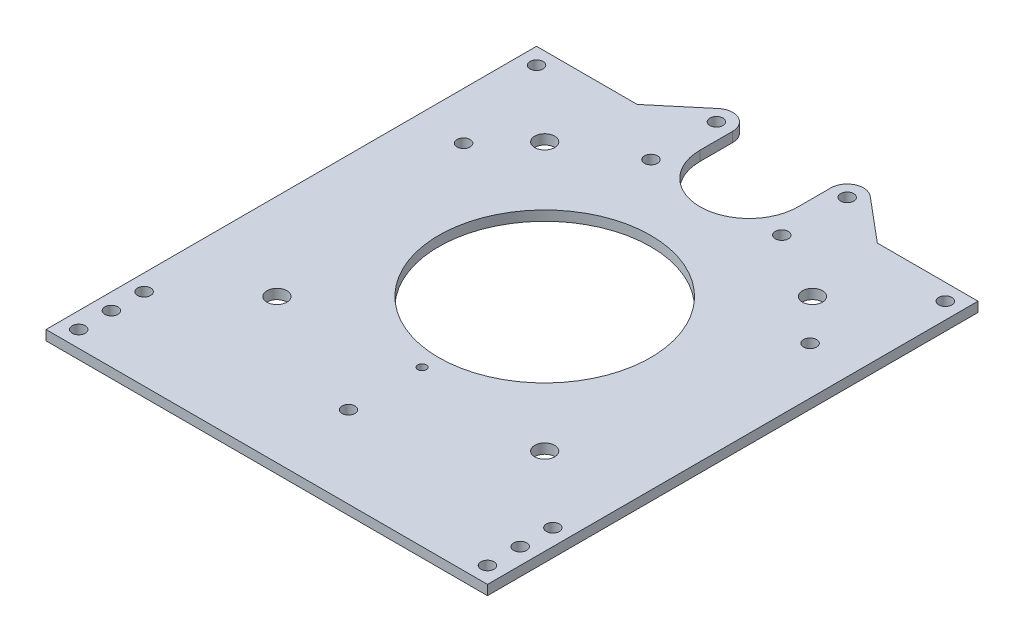
ISO-10303-21;
HEADER;
FILE_DESCRIPTION(('STEP AP214'),'2;1');
FILE_NAME('part.step','',(''),(''),'','','');
FILE_SCHEMA(('AUTOMOTIVE_DESIGN { 1 0 10303 214 1 1 1 1 }'));
ENDSEC;
DATA;
#1=APPLICATION_CONTEXT('core data for automotive mechanical design processes');
#2=APPLICATION_PROTOCOL_DEFINITION('international standard','automotive_design',2000,#1);
#3=PRODUCT_CONTEXT('',#1,'mechanical');
#4=PRODUCT('Part','Part','',(#3));
#5=PRODUCT_RELATED_PRODUCT_CATEGORY('part','',(#4));
#6=PRODUCT_DEFINITION_FORMATION('','',#4);
#7=PRODUCT_DEFINITION_CONTEXT('part definition',#1,'design');
#8=PRODUCT_DEFINITION('design','',#6,#7);
#9=PRODUCT_DEFINITION_SHAPE('','',#8);
#10=(LENGTH_UNIT() NAMED_UNIT(*) SI_UNIT(.MILLI.,.METRE.));
#11=(NAMED_UNIT(*) PLANE_ANGLE_UNIT() SI_UNIT($,.RADIAN.));
#12=(NAMED_UNIT(*) SI_UNIT($,.STERADIAN.) SOLID_ANGLE_UNIT());
#13=UNCERTAINTY_MEASURE_WITH_UNIT(LENGTH_MEASURE(1.E-05),#10,'distance_accuracy_value','');
#14=(GEOMETRIC_REPRESENTATION_CONTEXT(3) GLOBAL_UNCERTAINTY_ASSIGNED_CONTEXT((#13)) GLOBAL_UNIT_ASSIGNED_CONTEXT((#10,
#11,#12)) REPRESENTATION_CONTEXT('',''));
#15=CARTESIAN_POINT('',(0.,0.,0.));
#16=DIRECTION('',(0.,0.,1.));
#17=DIRECTION('',(1.,0.,0.));
#18=AXIS2_PLACEMENT_3D('',#15,#16,#17);
#19=CARTESIAN_POINT('',(87.5,3.,-157.5));
#20=DIRECTION('',(0.,-1.,0.));
#21=DIRECTION('',(0.,0.,-1.));
#22=AXIS2_PLACEMENT_3D('',#19,#20,#21);
#23=CYLINDRICAL_SURFACE('',#22,5.00000000000002);
#24=CARTESIAN_POINT('',(87.5,0.,-157.5));
#25=DIRECTION('',(0.,1.,0.));
#26=DIRECTION('',(0.,0.,1.));
#27=AXIS2_PLACEMENT_3D('',#24,#25,#26);
#28=CIRCLE('',#27,5.00000000000002);
#29=CARTESIAN_POINT('',(90.7139380484328,0.,-161.330222215595));
#30=VERTEX_POINT('',#29);
#31=CARTESIAN_POINT('',(82.5,0.,-157.5));
#32=VERTEX_POINT('',#31);
#33=EDGE_CURVE('E222',#30,#32,#28,.T.);
#34=ORIENTED_EDGE('',*,*,#33,.T.);
#35=DIRECTION('',(0.,-1.,0.));
#36=VECTOR('',#35,1.);
#37=CARTESIAN_POINT('',(82.5,3.,-157.5));
#38=LINE('',#37,#36);
#39=CARTESIAN_POINT('',(82.5,3.,-157.5));
#40=VERTEX_POINT('',#39);
#41=EDGE_CURVE('E11',#40,#32,#38,.T.);
#42=ORIENTED_EDGE('',*,*,#41,.F.);
#43=CARTESIAN_POINT('',(87.5,3.,-157.5));
#44=DIRECTION('',(0.,1.,0.));
#45=DIRECTION('',(0.,0.,1.));
#46=AXIS2_PLACEMENT_3D('',#43,#44,#45);
#47=CIRCLE('',#46,5.00000000000002);
#48=CARTESIAN_POINT('',(90.7139380484328,3.,-161.330222215595));
#49=VERTEX_POINT('',#48);
#50=EDGE_CURVE('E352',#49,#40,#47,.T.);
#51=ORIENTED_EDGE('',*,*,#50,.F.);
#52=DIRECTION('',(0.,-1.,0.));
#53=VECTOR('',#52,1.);
#54=CARTESIAN_POINT('',(90.7139380484328,3.,-161.330222215595));
#55=LINE('',#54,#53);
#56=EDGE_CURVE('E52',#49,#30,#55,.T.);
#57=ORIENTED_EDGE('',*,*,#56,.T.);
#58=EDGE_LOOP('',(#34,#42,#51,#57));
#59=FACE_BOUND('',#58,.T.);
#60=ADVANCED_FACE('F35',(#59),#23,.T.);
#61=CARTESIAN_POINT('',(82.5,3.,0.));
#62=DIRECTION('',(1.,0.,0.));
#63=DIRECTION('',(0.,0.,-1.));
#64=AXIS2_PLACEMENT_3D('',#61,#62,#63);
#65=PLANE('',#64);
#66=DIRECTION('',(0.,0.,1.));
#67=VECTOR('',#66,1.);
#68=CARTESIAN_POINT('',(82.5,0.,0.));
#69=LINE('',#68,#67);
#70=CARTESIAN_POINT('',(82.5,0.,-147.5));
#71=VERTEX_POINT('',#70);
#72=EDGE_CURVE('E224',#32,#71,#69,.T.);
#73=ORIENTED_EDGE('',*,*,#72,.T.);
#74=DIRECTION('',(0.,-1.,0.));
#75=VECTOR('',#74,1.);
#76=CARTESIAN_POINT('',(82.5,3.,-147.5));
#77=LINE('',#76,#75);
#78=CARTESIAN_POINT('',(82.5,3.,-147.5));
#79=VERTEX_POINT('',#78);
#80=EDGE_CURVE('E44',#79,#71,#77,.T.);
#81=ORIENTED_EDGE('',*,*,#80,.F.);
#82=DIRECTION('',(0.,0.,1.));
#83=VECTOR('',#82,1.);
#84=CARTESIAN_POINT('',(82.5,3.,0.));
#85=LINE('',#84,#83);
#86=EDGE_CURVE('E102',#40,#79,#85,.T.);
#87=ORIENTED_EDGE('',*,*,#86,.F.);
#88=ORIENTED_EDGE('',*,*,#41,.T.);
#89=EDGE_LOOP('',(#73,#81,#87,#88));
#90=FACE_BOUND('',#89,.T.);
#91=ADVANCED_FACE('F334',(#90),#65,.F.);
#92=CARTESIAN_POINT('',(67.5,3.,-147.5));
#93=DIRECTION('',(0.,-1.,0.));
#94=DIRECTION('',(0.,0.,-1.));
#95=AXIS2_PLACEMENT_3D('',#92,#93,#94);
#96=CYLINDRICAL_SURFACE('',#95,15.);
#97=CARTESIAN_POINT('',(67.5,0.,-147.5));
#98=DIRECTION('',(0.,1.,0.));
#99=DIRECTION('',(0.,0.,1.));
#100=AXIS2_PLACEMENT_3D('',#97,#98,#99);
#101=CIRCLE('',#100,15.);
#102=CARTESIAN_POINT('',(52.5,0.,-147.5));
#103=VERTEX_POINT('',#102);
#104=EDGE_CURVE('E227',#103,#71,#101,.T.);
#105=ORIENTED_EDGE('',*,*,#104,.F.);
#106=DIRECTION('',(0.,-1.,0.));
#107=VECTOR('',#106,1.);
#108=CARTESIAN_POINT('',(52.5,3.,-147.5));
#109=LINE('',#108,#107);
#110=CARTESIAN_POINT('',(52.5,3.,-147.5));
#111=VERTEX_POINT('',#110);
#112=EDGE_CURVE('E327',#111,#103,#109,.T.);
#113=ORIENTED_EDGE('',*,*,#112,.F.);
#114=CARTESIAN_POINT('',(67.5,3.,-147.5));
#115=DIRECTION('',(0.,1.,0.));
#116=DIRECTION('',(0.,0.,1.));
#117=AXIS2_PLACEMENT_3D('',#114,#115,#116);
#118=CIRCLE('',#117,15.);
#119=EDGE_CURVE('E333',#111,#79,#118,.T.);
#120=ORIENTED_EDGE('',*,*,#119,.T.);
#121=ORIENTED_EDGE('',*,*,#80,.T.);
#122=EDGE_LOOP('',(#105,#113,#120,#121));
#123=FACE_BOUND('',#122,.T.);
#124=ADVANCED_FACE('F331',(#123),#96,.F.);
#125=CARTESIAN_POINT('',(52.5,3.,0.));
#126=DIRECTION('',(1.,0.,0.));
#127=DIRECTION('',(0.,0.,-1.));
#128=AXIS2_PLACEMENT_3D('',#125,#126,#127);
#129=PLANE('',#128);
#130=DIRECTION('',(0.,0.,1.));
#131=VECTOR('',#130,1.);
#132=CARTESIAN_POINT('',(52.5,0.,0.));
#133=LINE('',#132,#131);
#134=CARTESIAN_POINT('',(52.5,0.,-157.5));
#135=VERTEX_POINT('',#134);
#136=EDGE_CURVE('E230',#135,#103,#133,.T.);
#137=ORIENTED_EDGE('',*,*,#136,.F.);
#138=DIRECTION('',(0.,-1.,0.));
#139=VECTOR('',#138,1.);
#140=CARTESIAN_POINT('',(52.5,3.,-157.5));
#141=LINE('',#140,#139);
#142=CARTESIAN_POINT('',(52.5,3.,-157.5));
#143=VERTEX_POINT('',#142);
#144=EDGE_CURVE('E325',#143,#135,#141,.T.);
#145=ORIENTED_EDGE('',*,*,#144,.F.);
#146=DIRECTION('',(0.,0.,1.));
#147=VECTOR('',#146,1.);
#148=CARTESIAN_POINT('',(52.5,3.,0.));
#149=LINE('',#148,#147);
#150=EDGE_CURVE('E346',#143,#111,#149,.T.);
#151=ORIENTED_EDGE('',*,*,#150,.T.);
#152=ORIENTED_EDGE('',*,*,#112,.T.);
#153=EDGE_LOOP('',(#137,#145,#151,#152));
#154=FACE_BOUND('',#153,.T.);
#155=ADVANCED_FACE('F343',(#154),#129,.T.);
#156=CARTESIAN_POINT('',(47.5,3.,-157.5));
#157=DIRECTION('',(0.,-1.,0.));
#158=DIRECTION('',(0.,0.,-1.));
#159=AXIS2_PLACEMENT_3D('',#156,#157,#158);
#160=CYLINDRICAL_SURFACE('',#159,5.);
#161=CARTESIAN_POINT('',(47.5,0.,-157.5));
#162=DIRECTION('',(0.,1.,0.));
#163=DIRECTION('',(0.,0.,1.));
#164=AXIS2_PLACEMENT_3D('',#161,#162,#163);
#165=CIRCLE('',#164,5.);
#166=CARTESIAN_POINT('',(44.2860619515673,0.,-161.330222215595));
#167=VERTEX_POINT('',#166);
#168=EDGE_CURVE('E233',#167,#135,#165,.F.);
#169=ORIENTED_EDGE('',*,*,#168,.F.);
#170=DIRECTION('',(0.,-1.,0.));
#171=VECTOR('',#170,1.);
#172=CARTESIAN_POINT('',(44.2860619515673,3.,-161.330222215595));
#173=LINE('',#172,#171);
#174=CARTESIAN_POINT('',(44.2860619515673,3.,-161.330222215595));
#175=VERTEX_POINT('',#174);
#176=EDGE_CURVE('E323',#175,#167,#173,.T.);
#177=ORIENTED_EDGE('',*,*,#176,.F.);
#178=CARTESIAN_POINT('',(47.5,3.,-157.5));
#179=DIRECTION('',(0.,1.,0.));
#180=DIRECTION('',(0.,0.,1.));
#181=AXIS2_PLACEMENT_3D('',#178,#179,#180);
#182=CIRCLE('',#181,5.);
#183=EDGE_CURVE('E350',#175,#143,#182,.F.);
#184=ORIENTED_EDGE('',*,*,#183,.T.);
#185=ORIENTED_EDGE('',*,*,#144,.T.);
#186=EDGE_LOOP('',(#169,#177,#184,#185));
#187=FACE_BOUND('',#186,.T.);
#188=ADVANCED_FACE('F394',(#187),#160,.T.);
#189=CARTESIAN_POINT('',(-61.1416928177337,3.,-72.8658320728258));
#190=DIRECTION('',(0.642787609686539,0.,0.766044443118978));
#191=DIRECTION('',(0.766044443118978,0.,-0.642787609686539));
#192=AXIS2_PLACEMENT_3D('',#189,#190,#191);
#193=PLANE('',#192);
#194=DIRECTION('',(-0.766044443118978,0.,0.642787609686539));
#195=VECTOR('',#194,1.);
#196=CARTESIAN_POINT('',(-61.1416928177337,0.,-72.8658320728258));
#197=LINE('',#196,#195);
#198=CARTESIAN_POINT('',(30.7832289212413,0.,-150.));
#199=VERTEX_POINT('',#198);
#200=EDGE_CURVE('E236',#167,#199,#197,.T.);
#201=ORIENTED_EDGE('',*,*,#200,.T.);
#202=DIRECTION('',(0.,-1.,0.));
#203=VECTOR('',#202,1.);
#204=CARTESIAN_POINT('',(30.7832289212413,3.,-150.));
#205=LINE('',#204,#203);
#206=CARTESIAN_POINT('',(30.7832289212413,3.,-150.));
#207=VERTEX_POINT('',#206);
#208=EDGE_CURVE('E321',#207,#199,#205,.T.);
#209=ORIENTED_EDGE('',*,*,#208,.F.);
#210=DIRECTION('',(-0.766044443118978,0.,0.642787609686539));
#211=VECTOR('',#210,1.);
#212=CARTESIAN_POINT('',(-61.1416928177337,3.,-72.8658320728258));
#213=LINE('',#212,#211);
#214=EDGE_CURVE('E357',#175,#207,#213,.T.);
#215=ORIENTED_EDGE('',*,*,#214,.F.);
#216=ORIENTED_EDGE('',*,*,#176,.T.);
#217=EDGE_LOOP('',(#201,#209,#215,#216));
#218=FACE_BOUND('',#217,.T.);
#219=ADVANCED_FACE('F397',(#218),#193,.F.);
#220=CARTESIAN_POINT('',(0.,3.,-150.));
#221=DIRECTION('',(0.,0.,-1.));
#222=DIRECTION('',(-1.,0.,0.));
#223=AXIS2_PLACEMENT_3D('',#220,#221,#222);
#224=PLANE('',#223);
#225=DIRECTION('',(1.,0.,0.));
#226=VECTOR('',#225,1.);
#227=CARTESIAN_POINT('',(0.,0.,-150.));
#228=LINE('',#227,#226);
#229=CARTESIAN_POINT('',(0.,0.,-150.));
#230=VERTEX_POINT('',#229);
#231=EDGE_CURVE('E239',#230,#199,#228,.T.);
#232=ORIENTED_EDGE('',*,*,#231,.F.);
#233=DIRECTION('',(0.,-1.,0.));
#234=VECTOR('',#233,1.);
#235=CARTESIAN_POINT('',(0.,3.,-150.));
#236=LINE('',#235,#234);
#237=CARTESIAN_POINT('',(0.,3.,-150.));
#238=VERTEX_POINT('',#237);
#239=EDGE_CURVE('E319',#238,#230,#236,.T.);
#240=ORIENTED_EDGE('',*,*,#239,.F.);
#241=DIRECTION('',(1.,0.,0.));
#242=VECTOR('',#241,1.);
#243=CARTESIAN_POINT('',(0.,3.,-150.));
#244=LINE('',#243,#242);
#245=EDGE_CURVE('E359',#238,#207,#244,.T.);
#246=ORIENTED_EDGE('',*,*,#245,.T.);
#247=ORIENTED_EDGE('',*,*,#208,.T.);
#248=EDGE_LOOP('',(#232,#240,#246,#247));
#249=FACE_BOUND('',#248,.T.);
#250=ADVANCED_FACE('F372',(#249),#224,.T.);
#251=CARTESIAN_POINT('',(0.,3.,0.));
#252=DIRECTION('',(-1.,0.,0.));
#253=DIRECTION('',(0.,0.,1.));
#254=AXIS2_PLACEMENT_3D('',#251,#252,#253);
#255=PLANE('',#254);
#256=DIRECTION('',(0.,0.,-1.));
#257=VECTOR('',#256,1.);
#258=CARTESIAN_POINT('',(0.,0.,0.));
#259=LINE('',#258,#257);
#260=CARTESIAN_POINT('',(0.,0.,0.));
#261=VERTEX_POINT('',#260);
#262=EDGE_CURVE('E242',#261,#230,#259,.T.);
#263=ORIENTED_EDGE('',*,*,#262,.F.);
#264=DIRECTION('',(0.,-1.,0.));
#265=VECTOR('',#264,1.);
#266=CARTESIAN_POINT('',(0.,3.,0.));
#267=LINE('',#266,#265);
#268=CARTESIAN_POINT('',(0.,3.,0.));
#269=VERTEX_POINT('',#268);
#270=EDGE_CURVE('E317',#269,#261,#267,.T.);
#271=ORIENTED_EDGE('',*,*,#270,.F.);
#272=DIRECTION('',(0.,0.,-1.));
#273=VECTOR('',#272,1.);
#274=CARTESIAN_POINT('',(0.,3.,0.));
#275=LINE('',#274,#273);
#276=EDGE_CURVE('E362',#269,#238,#275,.T.);
#277=ORIENTED_EDGE('',*,*,#276,.T.);
#278=ORIENTED_EDGE('',*,*,#239,.T.);
#279=EDGE_LOOP('',(#263,#271,#277,#278));
#280=FACE_BOUND('',#279,.T.);
#281=ADVANCED_FACE('F366',(#280),#255,.T.);
#282=CARTESIAN_POINT('',(0.,3.,0.));
#283=DIRECTION('',(0.,0.,-1.));
#284=DIRECTION('',(-1.,0.,0.));
#285=AXIS2_PLACEMENT_3D('',#282,#283,#284);
#286=PLANE('',#285);
#287=DIRECTION('',(1.,0.,0.));
#288=VECTOR('',#287,1.);
#289=CARTESIAN_POINT('',(0.,0.,0.));
#290=LINE('',#289,#288);
#291=CARTESIAN_POINT('',(135.,0.,0.));
#292=VERTEX_POINT('',#291);
#293=EDGE_CURVE('E245',#261,#292,#290,.T.);
#294=ORIENTED_EDGE('',*,*,#293,.T.);
#295=DIRECTION('',(0.,-1.,0.));
#296=VECTOR('',#295,1.);
#297=CARTESIAN_POINT('',(135.,3.,0.));
#298=LINE('',#297,#296);
#299=CARTESIAN_POINT('',(135.,3.,0.));
#300=VERTEX_POINT('',#299);
#301=EDGE_CURVE('E151',#300,#292,#298,.T.);
#302=ORIENTED_EDGE('',*,*,#301,.F.);
#303=DIRECTION('',(1.,0.,0.));
#304=VECTOR('',#303,1.);
#305=CARTESIAN_POINT('',(0.,3.,0.));
#306=LINE('',#305,#304);
#307=EDGE_CURVE('E139',#269,#300,#306,.T.);
#308=ORIENTED_EDGE('',*,*,#307,.F.);
#309=ORIENTED_EDGE('',*,*,#270,.T.);
#310=EDGE_LOOP('',(#294,#302,#308,#309));
#311=FACE_BOUND('',#310,.T.);
#312=ADVANCED_FACE('F375',(#311),#286,.F.);
#313=CARTESIAN_POINT('',(135.,3.,0.));
#314=DIRECTION('',(-1.,0.,0.));
#315=DIRECTION('',(0.,0.,1.));
#316=AXIS2_PLACEMENT_3D('',#313,#314,#315);
#317=PLANE('',#316);
#318=DIRECTION('',(0.,0.,-1.));
#319=VECTOR('',#318,1.);
#320=CARTESIAN_POINT('',(135.,0.,0.));
#321=LINE('',#320,#319);
#322=CARTESIAN_POINT('',(135.,0.,-150.));
#323=VERTEX_POINT('',#322);
#324=EDGE_CURVE('E148',#292,#323,#321,.T.);
#325=ORIENTED_EDGE('',*,*,#324,.T.);
#326=DIRECTION('',(0.,-1.,0.));
#327=VECTOR('',#326,1.);
#328=CARTESIAN_POINT('',(135.,3.,-150.));
#329=LINE('',#328,#327);
#330=CARTESIAN_POINT('',(135.,3.,-150.));
#331=VERTEX_POINT('',#330);
#332=EDGE_CURVE('E145',#331,#323,#329,.T.);
#333=ORIENTED_EDGE('',*,*,#332,.F.);
#334=DIRECTION('',(0.,0.,-1.));
#335=VECTOR('',#334,1.);
#336=CARTESIAN_POINT('',(135.,3.,0.));
#337=LINE('',#336,#335);
#338=EDGE_CURVE('E130',#300,#331,#337,.T.);
#339=ORIENTED_EDGE('',*,*,#338,.F.);
#340=ORIENTED_EDGE('',*,*,#301,.T.);
#341=EDGE_LOOP('',(#325,#333,#339,#340));
#342=FACE_BOUND('',#341,.T.);
#343=ADVANCED_FACE('F146',(#342),#317,.F.);
#344=CARTESIAN_POINT('',(0.,3.,-150.));
#345=DIRECTION('',(0.,0.,-1.));
#346=DIRECTION('',(-1.,0.,0.));
#347=AXIS2_PLACEMENT_3D('',#344,#345,#346);
#348=PLANE('',#347);
#349=DIRECTION('',(1.,0.,0.));
#350=VECTOR('',#349,1.);
#351=CARTESIAN_POINT('',(0.,0.,-150.));
#352=LINE('',#351,#350);
#353=CARTESIAN_POINT('',(104.216771078759,0.,-150.));
#354=VERTEX_POINT('',#353);
#355=EDGE_CURVE('E248',#354,#323,#352,.T.);
#356=ORIENTED_EDGE('',*,*,#355,.F.);
#357=DIRECTION('',(0.,-1.,0.));
#358=VECTOR('',#357,1.);
#359=CARTESIAN_POINT('',(104.216771078759,3.,-150.));
#360=LINE('',#359,#358);
#361=CARTESIAN_POINT('',(104.216771078759,3.,-150.));
#362=VERTEX_POINT('',#361);
#363=EDGE_CURVE('E90',#362,#354,#360,.T.);
#364=ORIENTED_EDGE('',*,*,#363,.F.);
#365=DIRECTION('',(1.,0.,0.));
#366=VECTOR('',#365,1.);
#367=CARTESIAN_POINT('',(0.,3.,-150.));
#368=LINE('',#367,#366);
#369=EDGE_CURVE('E136',#362,#331,#368,.T.);
#370=ORIENTED_EDGE('',*,*,#369,.T.);
#371=ORIENTED_EDGE('',*,*,#332,.T.);
#372=EDGE_LOOP('',(#356,#364,#370,#371));
#373=FACE_BOUND('',#372,.T.);
#374=ADVANCED_FACE('F153',(#373),#348,.T.);
#375=CARTESIAN_POINT('',(5.00000000000003,3.,-25.));
#376=DIRECTION('',(0.,-1.,0.));
#377=DIRECTION('',(0.,0.,-1.));
#378=AXIS2_PLACEMENT_3D('',#375,#376,#377);
#379=CYLINDRICAL_SURFACE('',#378,2.);
#380=CARTESIAN_POINT('',(5.00000000000003,3.,-25.));
#381=DIRECTION('',(0.,1.,0.));
#382=DIRECTION('',(0.,0.,1.));
#383=AXIS2_PLACEMENT_3D('',#380,#381,#382);
#384=CIRCLE('',#383,2.);
#385=CARTESIAN_POINT('',(5.00000000000003,3.,-23.));
#386=VERTEX_POINT('',#385);
#387=EDGE_CURVE('E213',#386,#386,#384,.F.);
#388=ORIENTED_EDGE('',*,*,#387,.F.);
#389=EDGE_LOOP('',(#388));
#390=FACE_BOUND('',#389,.T.);
#391=CARTESIAN_POINT('',(5.00000000000003,0.,-25.));
#392=DIRECTION('',(0.,1.,0.));
#393=DIRECTION('',(0.,0.,1.));
#394=AXIS2_PLACEMENT_3D('',#391,#392,#393);
#395=CIRCLE('',#394,2.);
#396=CARTESIAN_POINT('',(5.00000000000003,0.,-23.));
#397=VERTEX_POINT('',#396);
#398=EDGE_CURVE('E307',#397,#397,#395,.F.);
#399=ORIENTED_EDGE('',*,*,#398,.T.);
#400=EDGE_LOOP('',(#399));
#401=FACE_BOUND('',#400,.T.);
#402=ADVANCED_FACE('F430',(#390,#401),#379,.F.);
#403=CARTESIAN_POINT('',(130.,3.,-25.));
#404=DIRECTION('',(0.,-1.,0.));
#405=DIRECTION('',(0.,0.,-1.));
#406=AXIS2_PLACEMENT_3D('',#403,#404,#405);
#407=CYLINDRICAL_SURFACE('',#406,2.);
#408=CARTESIAN_POINT('',(130.,3.,-25.));
#409=DIRECTION('',(0.,1.,0.));
#410=DIRECTION('',(0.,0.,1.));
#411=AXIS2_PLACEMENT_3D('',#408,#409,#410);
#412=CIRCLE('',#411,2.);
#413=CARTESIAN_POINT('',(130.,3.,-23.));
#414=VERTEX_POINT('',#413);
#415=EDGE_CURVE('E210',#414,#414,#412,.T.);
#416=ORIENTED_EDGE('',*,*,#415,.T.);
#417=EDGE_LOOP('',(#416));
#418=FACE_BOUND('',#417,.T.);
#419=CARTESIAN_POINT('',(130.,0.,-25.));
#420=DIRECTION('',(0.,1.,0.));
#421=DIRECTION('',(0.,0.,1.));
#422=AXIS2_PLACEMENT_3D('',#419,#420,#421);
#423=CIRCLE('',#422,2.);
#424=CARTESIAN_POINT('',(130.,0.,-23.));
#425=VERTEX_POINT('',#424);
#426=EDGE_CURVE('E304',#425,#425,#423,.T.);
#427=ORIENTED_EDGE('',*,*,#426,.F.);
#428=EDGE_LOOP('',(#427));
#429=FACE_BOUND('',#428,.T.);
#430=ADVANCED_FACE('F439',(#418,#429),#407,.F.);
#431=CARTESIAN_POINT('',(130.,3.,-5.));
#432=DIRECTION('',(0.,-1.,0.));
#433=DIRECTION('',(0.,0.,-1.));
#434=AXIS2_PLACEMENT_3D('',#431,#432,#433);
#435=CYLINDRICAL_SURFACE('',#434,2.);
#436=CARTESIAN_POINT('',(130.,3.,-5.));
#437=DIRECTION('',(0.,1.,0.));
#438=DIRECTION('',(0.,0.,1.));
#439=AXIS2_PLACEMENT_3D('',#436,#437,#438);
#440=CIRCLE('',#439,2.);
#441=CARTESIAN_POINT('',(130.,3.,-3.00000000000001));
#442=VERTEX_POINT('',#441);
#443=EDGE_CURVE('E207',#442,#442,#440,.F.);
#444=ORIENTED_EDGE('',*,*,#443,.F.);
#445=EDGE_LOOP('',(#444));
#446=FACE_BOUND('',#445,.T.);
#447=CARTESIAN_POINT('',(130.,0.,-5.));
#448=DIRECTION('',(0.,1.,0.));
#449=DIRECTION('',(0.,0.,1.));
#450=AXIS2_PLACEMENT_3D('',#447,#448,#449);
#451=CIRCLE('',#450,2.);
#452=CARTESIAN_POINT('',(130.,0.,-3.00000000000001));
#453=VERTEX_POINT('',#452);
#454=EDGE_CURVE('E301',#453,#453,#451,.F.);
#455=ORIENTED_EDGE('',*,*,#454,.T.);
#456=EDGE_LOOP('',(#455));
#457=FACE_BOUND('',#456,.T.);
#458=ADVANCED_FACE('F449',(#446,#457),#435,.F.);
#459=CARTESIAN_POINT('',(5.,3.,-4.99999999999995));
#460=DIRECTION('',(0.,-1.,0.));
#461=DIRECTION('',(0.,0.,-1.));
#462=AXIS2_PLACEMENT_3D('',#459,#460,#461);
#463=CYLINDRICAL_SURFACE('',#462,2.);
#464=CARTESIAN_POINT('',(5.,3.,-4.99999999999995));
#465=DIRECTION('',(0.,1.,0.));
#466=DIRECTION('',(0.,0.,1.));
#467=AXIS2_PLACEMENT_3D('',#464,#465,#466);
#468=CIRCLE('',#467,2.);
#469=CARTESIAN_POINT('',(5.,3.,-2.99999999999995));
#470=VERTEX_POINT('',#469);
#471=EDGE_CURVE('E204',#470,#470,#468,.T.);
#472=ORIENTED_EDGE('',*,*,#471,.T.);
#473=EDGE_LOOP('',(#472));
#474=FACE_BOUND('',#473,.T.);
#475=CARTESIAN_POINT('',(5.,0.,-4.99999999999995));
#476=DIRECTION('',(0.,1.,0.));
#477=DIRECTION('',(0.,0.,1.));
#478=AXIS2_PLACEMENT_3D('',#475,#476,#477);
#479=CIRCLE('',#478,2.);
#480=CARTESIAN_POINT('',(5.,0.,-2.99999999999995));
#481=VERTEX_POINT('',#480);
#482=EDGE_CURVE('E298',#481,#481,#479,.T.);
#483=ORIENTED_EDGE('',*,*,#482,.F.);
#484=EDGE_LOOP('',(#483));
#485=FACE_BOUND('',#484,.T.);
#486=ADVANCED_FACE('F459',(#474,#485),#463,.F.);
#487=CARTESIAN_POINT('',(5.,3.,-145.));
#488=DIRECTION('',(0.,-1.,0.));
#489=DIRECTION('',(0.,0.,-1.));
#490=AXIS2_PLACEMENT_3D('',#487,#488,#489);
#491=CYLINDRICAL_SURFACE('',#490,2.);
#492=CARTESIAN_POINT('',(5.,3.,-145.));
#493=DIRECTION('',(0.,1.,0.));
#494=DIRECTION('',(0.,0.,1.));
#495=AXIS2_PLACEMENT_3D('',#492,#493,#494);
#496=CIRCLE('',#495,2.);
#497=CARTESIAN_POINT('',(5.,3.,-143.));
#498=VERTEX_POINT('',#497);
#499=EDGE_CURVE('E201',#498,#498,#496,.F.);
#500=ORIENTED_EDGE('',*,*,#499,.F.);
#501=EDGE_LOOP('',(#500));
#502=FACE_BOUND('',#501,.T.);
#503=CARTESIAN_POINT('',(5.,0.,-145.));
#504=DIRECTION('',(0.,1.,0.));
#505=DIRECTION('',(0.,0.,1.));
#506=AXIS2_PLACEMENT_3D('',#503,#504,#505);
#507=CIRCLE('',#506,2.);
#508=CARTESIAN_POINT('',(5.,0.,-143.));
#509=VERTEX_POINT('',#508);
#510=EDGE_CURVE('E295',#509,#509,#507,.F.);
#511=ORIENTED_EDGE('',*,*,#510,.T.);
#512=EDGE_LOOP('',(#511));
#513=FACE_BOUND('',#512,.T.);
#514=ADVANCED_FACE('F469',(#502,#513),#491,.F.);
#515=CARTESIAN_POINT('',(130.,3.,-145.));
#516=DIRECTION('',(0.,-1.,0.));
#517=DIRECTION('',(0.,0.,-1.));
#518=AXIS2_PLACEMENT_3D('',#515,#516,#517);
#519=CYLINDRICAL_SURFACE('',#518,2.);
#520=CARTESIAN_POINT('',(130.,3.,-145.));
#521=DIRECTION('',(0.,1.,0.));
#522=DIRECTION('',(0.,0.,1.));
#523=AXIS2_PLACEMENT_3D('',#520,#521,#522);
#524=CIRCLE('',#523,2.);
#525=CARTESIAN_POINT('',(130.,3.,-143.));
#526=VERTEX_POINT('',#525);
#527=EDGE_CURVE('E198',#526,#526,#524,.T.);
#528=ORIENTED_EDGE('',*,*,#527,.T.);
#529=EDGE_LOOP('',(#528));
#530=FACE_BOUND('',#529,.T.);
#531=CARTESIAN_POINT('',(130.,0.,-145.));
#532=DIRECTION('',(0.,1.,0.));
#533=DIRECTION('',(0.,0.,1.));
#534=AXIS2_PLACEMENT_3D('',#531,#532,#533);
#535=CIRCLE('',#534,2.);
#536=CARTESIAN_POINT('',(130.,0.,-143.));
#537=VERTEX_POINT('',#536);
#538=EDGE_CURVE('E292',#537,#537,#535,.T.);
#539=ORIENTED_EDGE('',*,*,#538,.F.);
#540=EDGE_LOOP('',(#539));
#541=FACE_BOUND('',#540,.T.);
#542=ADVANCED_FACE('F479',(#530,#541),#519,.F.);
#543=CARTESIAN_POINT('',(87.5,3.,-137.5));
#544=DIRECTION('',(0.,-1.,0.));
#545=DIRECTION('',(0.,0.,-1.));
#546=AXIS2_PLACEMENT_3D('',#543,#544,#545);
#547=CYLINDRICAL_SURFACE('',#546,2.);
#548=CARTESIAN_POINT('',(87.5,3.,-137.5));
#549=DIRECTION('',(0.,1.,0.));
#550=DIRECTION('',(0.,0.,1.));
#551=AXIS2_PLACEMENT_3D('',#548,#549,#550);
#552=CIRCLE('',#551,2.);
#553=CARTESIAN_POINT('',(87.5,3.,-135.5));
#554=VERTEX_POINT('',#553);
#555=EDGE_CURVE('E195',#554,#554,#552,.F.);
#556=ORIENTED_EDGE('',*,*,#555,.F.);
#557=EDGE_LOOP('',(#556));
#558=FACE_BOUND('',#557,.T.);
#559=CARTESIAN_POINT('',(87.5,0.,-137.5));
#560=DIRECTION('',(0.,1.,0.));
#561=DIRECTION('',(0.,0.,1.));
#562=AXIS2_PLACEMENT_3D('',#559,#560,#561);
#563=CIRCLE('',#562,2.);
#564=CARTESIAN_POINT('',(87.5,0.,-135.5));
#565=VERTEX_POINT('',#564);
#566=EDGE_CURVE('E289',#565,#565,#563,.F.);
#567=ORIENTED_EDGE('',*,*,#566,.T.);
#568=EDGE_LOOP('',(#567));
#569=FACE_BOUND('',#568,.T.);
#570=ADVANCED_FACE('F489',(#558,#569),#547,.F.);
#571=CARTESIAN_POINT('',(67.5,3.,-47.5));
#572=DIRECTION('',(0.,-1.,0.));
#573=DIRECTION('',(0.,0.,-1.));
#574=AXIS2_PLACEMENT_3D('',#571,#572,#573);
#575=CYLINDRICAL_SURFACE('',#574,1.29999999999999);
#576=CARTESIAN_POINT('',(67.5,3.,-47.5));
#577=DIRECTION('',(0.,1.,0.));
#578=DIRECTION('',(0.,0.,1.));
#579=AXIS2_PLACEMENT_3D('',#576,#577,#578);
#580=CIRCLE('',#579,1.29999999999999);
#581=CARTESIAN_POINT('',(67.5,3.,-46.2));
#582=VERTEX_POINT('',#581);
#583=EDGE_CURVE('E192',#582,#582,#580,.T.);
#584=ORIENTED_EDGE('',*,*,#583,.T.);
#585=EDGE_LOOP('',(#584));
#586=FACE_BOUND('',#585,.T.);
#587=CARTESIAN_POINT('',(67.5,0.,-47.5));
#588=DIRECTION('',(0.,1.,0.));
#589=DIRECTION('',(0.,0.,1.));
#590=AXIS2_PLACEMENT_3D('',#587,#588,#589);
#591=CIRCLE('',#590,1.29999999999999);
#592=CARTESIAN_POINT('',(67.5,0.,-46.2));
#593=VERTEX_POINT('',#592);
#594=EDGE_CURVE('E286',#593,#593,#591,.T.);
#595=ORIENTED_EDGE('',*,*,#594,.F.);
#596=EDGE_LOOP('',(#595));
#597=FACE_BOUND('',#596,.T.);
#598=ADVANCED_FACE('F499',(#586,#597),#575,.F.);
#599=CARTESIAN_POINT('',(67.5,3.,-85.));
#600=DIRECTION('',(0.,-1.,0.));
#601=DIRECTION('',(0.,0.,-1.));
#602=AXIS2_PLACEMENT_3D('',#599,#600,#601);
#603=CYLINDRICAL_SURFACE('',#602,32.4);
#604=CARTESIAN_POINT('',(67.5,3.,-85.));
#605=DIRECTION('',(0.,1.,0.));
#606=DIRECTION('',(0.,0.,1.));
#607=AXIS2_PLACEMENT_3D('',#604,#605,#606);
#608=CIRCLE('',#607,32.4);
#609=CARTESIAN_POINT('',(67.5,3.,-52.6));
#610=VERTEX_POINT('',#609);
#611=EDGE_CURVE('E189',#610,#610,#608,.T.);
#612=ORIENTED_EDGE('',*,*,#611,.T.);
#613=EDGE_LOOP('',(#612));
#614=FACE_BOUND('',#613,.T.);
#615=CARTESIAN_POINT('',(67.5,0.,-85.));
#616=DIRECTION('',(0.,1.,0.));
#617=DIRECTION('',(0.,0.,1.));
#618=AXIS2_PLACEMENT_3D('',#615,#616,#617);
#619=CIRCLE('',#618,32.4);
#620=CARTESIAN_POINT('',(67.5,0.,-52.6));
#621=VERTEX_POINT('',#620);
#622=EDGE_CURVE('E283',#621,#621,#619,.T.);
#623=ORIENTED_EDGE('',*,*,#622,.F.);
#624=EDGE_LOOP('',(#623));
#625=FACE_BOUND('',#624,.T.);
#626=ADVANCED_FACE('F509',(#614,#625),#603,.F.);
#627=CARTESIAN_POINT('',(108.441482630701,3.,-44.0585173692991));
#628=DIRECTION('',(0.,-1.,0.));
#629=DIRECTION('',(0.,0.,-1.));
#630=AXIS2_PLACEMENT_3D('',#627,#628,#629);
#631=CYLINDRICAL_SURFACE('',#630,3.0499999999999);
#632=CARTESIAN_POINT('',(108.441482630701,3.,-44.0585173692991));
#633=DIRECTION('',(0.,1.,0.));
#634=DIRECTION('',(0.,0.,1.));
#635=AXIS2_PLACEMENT_3D('',#632,#633,#634);
#636=CIRCLE('',#635,3.0499999999999);
#637=CARTESIAN_POINT('',(108.441482630701,3.,-41.0085173692992));
#638=VERTEX_POINT('',#637);
#639=EDGE_CURVE('E186',#638,#638,#636,.T.);
#640=ORIENTED_EDGE('',*,*,#639,.T.);
#641=EDGE_LOOP('',(#640));
#642=FACE_BOUND('',#641,.T.);
#643=CARTESIAN_POINT('',(108.441482630701,0.,-44.0585173692991));
#644=DIRECTION('',(0.,1.,0.));
#645=DIRECTION('',(0.,0.,1.));
#646=AXIS2_PLACEMENT_3D('',#643,#644,#645);
#647=CIRCLE('',#646,3.0499999999999);
#648=CARTESIAN_POINT('',(108.441482630701,0.,-41.0085173692992));
#649=VERTEX_POINT('',#648);
#650=EDGE_CURVE('E280',#649,#649,#647,.T.);
#651=ORIENTED_EDGE('',*,*,#650,.F.);
#652=EDGE_LOOP('',(#651));
#653=FACE_BOUND('',#652,.T.);
#654=ADVANCED_FACE('F519',(#642,#653),#631,.F.);
#655=CARTESIAN_POINT('',(26.5585173692991,3.,-44.0585173692989));
#656=DIRECTION('',(0.,-1.,0.));
#657=DIRECTION('',(0.,0.,-1.));
#658=AXIS2_PLACEMENT_3D('',#655,#656,#657);
#659=CYLINDRICAL_SURFACE('',#658,3.04999999999999);
#660=CARTESIAN_POINT('',(26.5585173692991,3.,-44.0585173692989));
#661=DIRECTION('',(0.,1.,0.));
#662=DIRECTION('',(0.,0.,1.));
#663=AXIS2_PLACEMENT_3D('',#660,#661,#662);
#664=CIRCLE('',#663,3.04999999999999);
#665=CARTESIAN_POINT('',(26.5585173692991,3.,-41.0085173692989));
#666=VERTEX_POINT('',#665);
#667=EDGE_CURVE('E183',#666,#666,#664,.T.);
#668=ORIENTED_EDGE('',*,*,#667,.T.);
#669=EDGE_LOOP('',(#668));
#670=FACE_BOUND('',#669,.T.);
#671=CARTESIAN_POINT('',(26.5585173692991,0.,-44.0585173692989));
#672=DIRECTION('',(0.,1.,0.));
#673=DIRECTION('',(0.,0.,1.));
#674=AXIS2_PLACEMENT_3D('',#671,#672,#673);
#675=CIRCLE('',#674,3.04999999999999);
#676=CARTESIAN_POINT('',(26.5585173692991,0.,-41.0085173692989));
#677=VERTEX_POINT('',#676);
#678=EDGE_CURVE('E277',#677,#677,#675,.T.);
#679=ORIENTED_EDGE('',*,*,#678,.F.);
#680=EDGE_LOOP('',(#679));
#681=FACE_BOUND('',#680,.T.);
#682=ADVANCED_FACE('F529',(#670,#681),#659,.F.);
#683=CARTESIAN_POINT('',(26.5585173692989,3.,-125.941482630701));
#684=DIRECTION('',(0.,-1.,0.));
#685=DIRECTION('',(0.,0.,-1.));
#686=AXIS2_PLACEMENT_3D('',#683,#684,#685);
#687=CYLINDRICAL_SURFACE('',#686,3.04999999999999);
#688=CARTESIAN_POINT('',(26.5585173692989,3.,-125.941482630701));
#689=DIRECTION('',(0.,1.,0.));
#690=DIRECTION('',(0.,0.,1.));
#691=AXIS2_PLACEMENT_3D('',#688,#689,#690);
#692=CIRCLE('',#691,3.04999999999999);
#693=CARTESIAN_POINT('',(26.5585173692989,3.,-122.891482630701));
#694=VERTEX_POINT('',#693);
#695=EDGE_CURVE('E180',#694,#694,#692,.T.);
#696=ORIENTED_EDGE('',*,*,#695,.T.);
#697=EDGE_LOOP('',(#696));
#698=FACE_BOUND('',#697,.T.);
#699=CARTESIAN_POINT('',(26.5585173692989,0.,-125.941482630701));
#700=DIRECTION('',(0.,1.,0.));
#701=DIRECTION('',(0.,0.,1.));
#702=AXIS2_PLACEMENT_3D('',#699,#700,#701);
#703=CIRCLE('',#702,3.04999999999999);
#704=CARTESIAN_POINT('',(26.5585173692989,0.,-122.891482630701));
#705=VERTEX_POINT('',#704);
#706=EDGE_CURVE('E274',#705,#705,#703,.T.);
#707=ORIENTED_EDGE('',*,*,#706,.F.);
#708=EDGE_LOOP('',(#707));
#709=FACE_BOUND('',#708,.T.);
#710=ADVANCED_FACE('F539',(#698,#709),#687,.F.);
#711=CARTESIAN_POINT('',(108.441482630701,3.,-125.941482630701));
#712=DIRECTION('',(0.,-1.,0.));
#713=DIRECTION('',(0.,0.,-1.));
#714=AXIS2_PLACEMENT_3D('',#711,#712,#713);
#715=CYLINDRICAL_SURFACE('',#714,3.04999999999999);
#716=CARTESIAN_POINT('',(108.441482630701,3.,-125.941482630701));
#717=DIRECTION('',(0.,1.,0.));
#718=DIRECTION('',(0.,0.,1.));
#719=AXIS2_PLACEMENT_3D('',#716,#717,#718);
#720=CIRCLE('',#719,3.04999999999999);
#721=CARTESIAN_POINT('',(108.441482630701,3.,-122.891482630701));
#722=VERTEX_POINT('',#721);
#723=EDGE_CURVE('E177',#722,#722,#720,.T.);
#724=ORIENTED_EDGE('',*,*,#723,.T.);
#725=EDGE_LOOP('',(#724));
#726=FACE_BOUND('',#725,.T.);
#727=CARTESIAN_POINT('',(108.441482630701,0.,-125.941482630701));
#728=DIRECTION('',(0.,1.,0.));
#729=DIRECTION('',(0.,0.,1.));
#730=AXIS2_PLACEMENT_3D('',#727,#728,#729);
#731=CIRCLE('',#730,3.04999999999999);
#732=CARTESIAN_POINT('',(108.441482630701,0.,-122.891482630701));
#733=VERTEX_POINT('',#732);
#734=EDGE_CURVE('E271',#733,#733,#731,.T.);
#735=ORIENTED_EDGE('',*,*,#734,.F.);
#736=EDGE_LOOP('',(#735));
#737=FACE_BOUND('',#736,.T.);
#738=ADVANCED_FACE('F549',(#726,#737),#715,.F.);
#739=CARTESIAN_POINT('',(67.5,3.,-25.));
#740=DIRECTION('',(0.,-1.,0.));
#741=DIRECTION('',(0.,0.,-1.));
#742=AXIS2_PLACEMENT_3D('',#739,#740,#741);
#743=CYLINDRICAL_SURFACE('',#742,2.00000000000001);
#744=CARTESIAN_POINT('',(67.5,3.,-25.));
#745=DIRECTION('',(0.,1.,0.));
#746=DIRECTION('',(0.,0.,1.));
#747=AXIS2_PLACEMENT_3D('',#744,#745,#746);
#748=CIRCLE('',#747,2.00000000000001);
#749=CARTESIAN_POINT('',(67.5,3.,-23.));
#750=VERTEX_POINT('',#749);
#751=EDGE_CURVE('E174',#750,#750,#748,.T.);
#752=ORIENTED_EDGE('',*,*,#751,.T.);
#753=EDGE_LOOP('',(#752));
#754=FACE_BOUND('',#753,.T.);
#755=CARTESIAN_POINT('',(67.5,0.,-25.));
#756=DIRECTION('',(0.,1.,0.));
#757=DIRECTION('',(0.,0.,1.));
#758=AXIS2_PLACEMENT_3D('',#755,#756,#757);
#759=CIRCLE('',#758,2.00000000000001);
#760=CARTESIAN_POINT('',(67.5,0.,-23.));
#761=VERTEX_POINT('',#760);
#762=EDGE_CURVE('E268',#761,#761,#759,.T.);
#763=ORIENTED_EDGE('',*,*,#762,.F.);
#764=EDGE_LOOP('',(#763));
#765=FACE_BOUND('',#764,.T.);
#766=ADVANCED_FACE('F559',(#754,#765),#743,.F.);
#767=CARTESIAN_POINT('',(14.5231444284645,3.,-113.168293767154));
#768=DIRECTION('',(0.,-1.,0.));
#769=DIRECTION('',(0.,0.,-1.));
#770=AXIS2_PLACEMENT_3D('',#767,#768,#769);
#771=CYLINDRICAL_SURFACE('',#770,1.99999999999997);
#772=CARTESIAN_POINT('',(14.5231444284645,3.,-113.168293767154));
#773=DIRECTION('',(0.,1.,0.));
#774=DIRECTION('',(0.,0.,1.));
#775=AXIS2_PLACEMENT_3D('',#772,#773,#774);
#776=CIRCLE('',#775,1.99999999999997);
#777=CARTESIAN_POINT('',(14.5231444284645,3.,-111.168293767154));
#778=VERTEX_POINT('',#777);
#779=EDGE_CURVE('E171',#778,#778,#776,.T.);
#780=ORIENTED_EDGE('',*,*,#779,.T.);
#781=EDGE_LOOP('',(#780));
#782=FACE_BOUND('',#781,.T.);
#783=CARTESIAN_POINT('',(14.5231444284645,0.,-113.168293767154));
#784=DIRECTION('',(0.,1.,0.));
#785=DIRECTION('',(0.,0.,1.));
#786=AXIS2_PLACEMENT_3D('',#783,#784,#785);
#787=CIRCLE('',#786,1.99999999999997);
#788=CARTESIAN_POINT('',(14.5231444284645,0.,-111.168293767154));
#789=VERTEX_POINT('',#788);
#790=EDGE_CURVE('E265',#789,#789,#787,.T.);
#791=ORIENTED_EDGE('',*,*,#790,.F.);
#792=EDGE_LOOP('',(#791));
#793=FACE_BOUND('',#792,.T.);
#794=ADVANCED_FACE('F569',(#782,#793),#771,.F.);
#795=CARTESIAN_POINT('',(120.476855571535,3.,-113.168293767154));
#796=DIRECTION('',(0.,-1.,0.));
#797=DIRECTION('',(0.,0.,-1.));
#798=AXIS2_PLACEMENT_3D('',#795,#796,#797);
#799=CYLINDRICAL_SURFACE('',#798,2.00000000000003);
#800=CARTESIAN_POINT('',(120.476855571535,3.,-113.168293767154));
#801=DIRECTION('',(0.,1.,0.));
#802=DIRECTION('',(0.,0.,1.));
#803=AXIS2_PLACEMENT_3D('',#800,#801,#802);
#804=CIRCLE('',#803,2.00000000000003);
#805=CARTESIAN_POINT('',(120.476855571535,3.,-111.168293767154));
#806=VERTEX_POINT('',#805);
#807=EDGE_CURVE('E168',#806,#806,#804,.F.);
#808=ORIENTED_EDGE('',*,*,#807,.F.);
#809=EDGE_LOOP('',(#808));
#810=FACE_BOUND('',#809,.T.);
#811=CARTESIAN_POINT('',(120.476855571535,0.,-113.168293767154));
#812=DIRECTION('',(0.,1.,0.));
#813=DIRECTION('',(0.,0.,1.));
#814=AXIS2_PLACEMENT_3D('',#811,#812,#813);
#815=CIRCLE('',#814,2.00000000000003);
#816=CARTESIAN_POINT('',(120.476855571535,0.,-111.168293767154));
#817=VERTEX_POINT('',#816);
#818=EDGE_CURVE('E262',#817,#817,#815,.F.);
#819=ORIENTED_EDGE('',*,*,#818,.T.);
#820=EDGE_LOOP('',(#819));
#821=FACE_BOUND('',#820,.T.);
#822=ADVANCED_FACE('F579',(#810,#821),#799,.F.);
#823=CARTESIAN_POINT('',(47.5,3.,-137.5));
#824=DIRECTION('',(0.,-1.,0.));
#825=DIRECTION('',(0.,0.,-1.));
#826=AXIS2_PLACEMENT_3D('',#823,#824,#825);
#827=CYLINDRICAL_SURFACE('',#826,2.);
#828=CARTESIAN_POINT('',(47.5,3.,-137.5));
#829=DIRECTION('',(0.,1.,0.));
#830=DIRECTION('',(0.,0.,1.));
#831=AXIS2_PLACEMENT_3D('',#828,#829,#830);
#832=CIRCLE('',#831,2.);
#833=CARTESIAN_POINT('',(47.5,3.,-135.5));
#834=VERTEX_POINT('',#833);
#835=EDGE_CURVE('E165',#834,#834,#832,.T.);
#836=ORIENTED_EDGE('',*,*,#835,.T.);
#837=EDGE_LOOP('',(#836));
#838=FACE_BOUND('',#837,.T.);
#839=CARTESIAN_POINT('',(47.5,0.,-137.5));
#840=DIRECTION('',(0.,1.,0.));
#841=DIRECTION('',(0.,0.,1.));
#842=AXIS2_PLACEMENT_3D('',#839,#840,#841);
#843=CIRCLE('',#842,2.);
#844=CARTESIAN_POINT('',(47.5,0.,-135.5));
#845=VERTEX_POINT('',#844);
#846=EDGE_CURVE('E259',#845,#845,#843,.T.);
#847=ORIENTED_EDGE('',*,*,#846,.F.);
#848=EDGE_LOOP('',(#847));
#849=FACE_BOUND('',#848,.T.);
#850=ADVANCED_FACE('F589',(#838,#849),#827,.F.);
#851=CARTESIAN_POINT('',(130.,3.,-15.));
#852=DIRECTION('',(0.,-1.,0.));
#853=DIRECTION('',(0.,0.,-1.));
#854=AXIS2_PLACEMENT_3D('',#851,#852,#853);
#855=CYLINDRICAL_SURFACE('',#854,2.);
#856=CARTESIAN_POINT('',(130.,3.,-15.));
#857=DIRECTION('',(0.,1.,0.));
#858=DIRECTION('',(0.,0.,1.));
#859=AXIS2_PLACEMENT_3D('',#856,#857,#858);
#860=CIRCLE('',#859,2.);
#861=CARTESIAN_POINT('',(130.,3.,-13.));
#862=VERTEX_POINT('',#861);
#863=EDGE_CURVE('E162',#862,#862,#860,.T.);
#864=ORIENTED_EDGE('',*,*,#863,.T.);
#865=EDGE_LOOP('',(#864));
#866=FACE_BOUND('',#865,.T.);
#867=CARTESIAN_POINT('',(130.,0.,-15.));
#868=DIRECTION('',(0.,1.,0.));
#869=DIRECTION('',(0.,0.,1.));
#870=AXIS2_PLACEMENT_3D('',#867,#868,#869);
#871=CIRCLE('',#870,2.);
#872=CARTESIAN_POINT('',(130.,0.,-13.));
#873=VERTEX_POINT('',#872);
#874=EDGE_CURVE('E256',#873,#873,#871,.T.);
#875=ORIENTED_EDGE('',*,*,#874,.F.);
#876=EDGE_LOOP('',(#875));
#877=FACE_BOUND('',#876,.T.);
#878=ADVANCED_FACE('F599',(#866,#877),#855,.F.);
#879=CARTESIAN_POINT('',(5.,3.,-15.));
#880=DIRECTION('',(0.,-1.,0.));
#881=DIRECTION('',(0.,0.,-1.));
#882=AXIS2_PLACEMENT_3D('',#879,#880,#881);
#883=CYLINDRICAL_SURFACE('',#882,2.);
#884=CARTESIAN_POINT('',(5.,3.,-15.));
#885=DIRECTION('',(0.,1.,0.));
#886=DIRECTION('',(0.,0.,1.));
#887=AXIS2_PLACEMENT_3D('',#884,#885,#886);
#888=CIRCLE('',#887,2.);
#889=CARTESIAN_POINT('',(5.,3.,-13.));
#890=VERTEX_POINT('',#889);
#891=EDGE_CURVE('E156',#890,#890,#888,.F.);
#892=ORIENTED_EDGE('',*,*,#891,.F.);
#893=EDGE_LOOP('',(#892));
#894=FACE_BOUND('',#893,.T.);
#895=CARTESIAN_POINT('',(5.,0.,-15.));
#896=DIRECTION('',(0.,1.,0.));
#897=DIRECTION('',(0.,0.,1.));
#898=AXIS2_PLACEMENT_3D('',#895,#896,#897);
#899=CIRCLE('',#898,2.);
#900=CARTESIAN_POINT('',(5.,0.,-13.));
#901=VERTEX_POINT('',#900);
#902=EDGE_CURVE('E253',#901,#901,#899,.F.);
#903=ORIENTED_EDGE('',*,*,#902,.T.);
#904=EDGE_LOOP('',(#903));
#905=FACE_BOUND('',#904,.T.);
#906=ADVANCED_FACE('F609',(#894,#905),#883,.F.);
#907=CARTESIAN_POINT('',(116.920440825216,3.,-139.34035540115));
#908=DIRECTION('',(0.642787609686539,0.,-0.766044443118978));
#909=DIRECTION('',(-0.766044443118978,0.,-0.642787609686539));
#910=AXIS2_PLACEMENT_3D('',#907,#908,#909);
#911=PLANE('',#910);
#912=DIRECTION('',(0.766044443118978,0.,0.642787609686539));
#913=VECTOR('',#912,1.);
#914=CARTESIAN_POINT('',(116.920440825216,0.,-139.34035540115));
#915=LINE('',#914,#913);
#916=EDGE_CURVE('E250',#30,#354,#915,.T.);
#917=ORIENTED_EDGE('',*,*,#916,.F.);
#918=ORIENTED_EDGE('',*,*,#56,.F.);
#919=DIRECTION('',(0.766044443118978,0.,0.642787609686539));
#920=VECTOR('',#919,1.);
#921=CARTESIAN_POINT('',(116.920440825216,3.,-139.34035540115));
#922=LINE('',#921,#920);
#923=EDGE_CURVE('E154',#49,#362,#922,.T.);
#924=ORIENTED_EDGE('',*,*,#923,.T.);
#925=ORIENTED_EDGE('',*,*,#363,.T.);
#926=EDGE_LOOP('',(#917,#918,#924,#925));
#927=FACE_BOUND('',#926,.T.);
#928=ADVANCED_FACE('F619',(#927),#911,.T.);
#929=CARTESIAN_POINT('',(87.5,3.,-157.5));
#930=DIRECTION('',(0.,-1.,0.));
#931=DIRECTION('',(0.,0.,-1.));
#932=AXIS2_PLACEMENT_3D('',#929,#930,#931);
#933=CYLINDRICAL_SURFACE('',#932,2.);
#934=CARTESIAN_POINT('',(87.5,3.,-157.5));
#935=DIRECTION('',(0.,1.,0.));
#936=DIRECTION('',(0.,0.,1.));
#937=AXIS2_PLACEMENT_3D('',#934,#935,#936);
#938=CIRCLE('',#937,2.);
#939=CARTESIAN_POINT('',(87.5,3.,-155.5));
#940=VERTEX_POINT('',#939);
#941=EDGE_CURVE('E313',#940,#940,#938,.T.);
#942=ORIENTED_EDGE('',*,*,#941,.T.);
#943=EDGE_LOOP('',(#942));
#944=FACE_BOUND('',#943,.T.);
#945=CARTESIAN_POINT('',(87.5,0.,-157.5));
#946=DIRECTION('',(0.,1.,0.));
#947=DIRECTION('',(0.,0.,1.));
#948=AXIS2_PLACEMENT_3D('',#945,#946,#947);
#949=CIRCLE('',#948,2.);
#950=CARTESIAN_POINT('',(87.5,0.,-155.5));
#951=VERTEX_POINT('',#950);
#952=EDGE_CURVE('E219',#951,#951,#949,.T.);
#953=ORIENTED_EDGE('',*,*,#952,.F.);
#954=EDGE_LOOP('',(#953));
#955=FACE_BOUND('',#954,.T.);
#956=ADVANCED_FACE('F37',(#944,#955),#933,.F.);
#957=CARTESIAN_POINT('',(47.5,3.,-157.5));
#958=DIRECTION('',(0.,-1.,0.));
#959=DIRECTION('',(0.,0.,-1.));
#960=AXIS2_PLACEMENT_3D('',#957,#958,#959);
#961=CYLINDRICAL_SURFACE('',#960,2.);
#962=CARTESIAN_POINT('',(47.5,3.,-157.5));
#963=DIRECTION('',(0.,1.,0.));
#964=DIRECTION('',(0.,0.,1.));
#965=AXIS2_PLACEMENT_3D('',#962,#963,#964);
#966=CIRCLE('',#965,2.);
#967=CARTESIAN_POINT('',(47.5,3.,-155.5));
#968=VERTEX_POINT('',#967);
#969=EDGE_CURVE('E216',#968,#968,#966,.F.);
#970=ORIENTED_EDGE('',*,*,#969,.F.);
#971=EDGE_LOOP('',(#970));
#972=FACE_BOUND('',#971,.T.);
#973=CARTESIAN_POINT('',(47.5,0.,-157.5));
#974=DIRECTION('',(0.,1.,0.));
#975=DIRECTION('',(0.,0.,1.));
#976=AXIS2_PLACEMENT_3D('',#973,#974,#975);
#977=CIRCLE('',#976,2.);
#978=CARTESIAN_POINT('',(47.5,0.,-155.5));
#979=VERTEX_POINT('',#978);
#980=EDGE_CURVE('E310',#979,#979,#977,.F.);
#981=ORIENTED_EDGE('',*,*,#980,.T.);
#982=EDGE_LOOP('',(#981));
#983=FACE_BOUND('',#982,.T.);
#984=ADVANCED_FACE('F637',(#972,#983),#961,.F.);
#985=CARTESIAN_POINT('',(0.,3.,0.));
#986=DIRECTION('',(0.,1.,0.));
#987=DIRECTION('',(0.,0.,1.));
#988=AXIS2_PLACEMENT_3D('',#985,#986,#987);
#989=PLANE('',#988);
#990=ORIENTED_EDGE('',*,*,#941,.F.);
#991=EDGE_LOOP('',(#990));
#992=FACE_BOUND('',#991,.T.);
#993=ORIENTED_EDGE('',*,*,#50,.T.);
#994=ORIENTED_EDGE('',*,*,#86,.T.);
#995=ORIENTED_EDGE('',*,*,#119,.F.);
#996=ORIENTED_EDGE('',*,*,#150,.F.);
#997=ORIENTED_EDGE('',*,*,#183,.F.);
#998=ORIENTED_EDGE('',*,*,#214,.T.);
#999=ORIENTED_EDGE('',*,*,#245,.F.);
#1000=ORIENTED_EDGE('',*,*,#276,.F.);
#1001=ORIENTED_EDGE('',*,*,#307,.T.);
#1002=ORIENTED_EDGE('',*,*,#338,.T.);
#1003=ORIENTED_EDGE('',*,*,#369,.F.);
#1004=ORIENTED_EDGE('',*,*,#923,.F.);
#1005=EDGE_LOOP('',(#993,#994,#995,#996,#997,#998,#999,#1000,#1001,#1002,#1003,#1004));
#1006=FACE_BOUND('',#1005,.T.);
#1007=ORIENTED_EDGE('',*,*,#891,.T.);
#1008=EDGE_LOOP('',(#1007));
#1009=FACE_BOUND('',#1008,.T.);
#1010=ORIENTED_EDGE('',*,*,#863,.F.);
#1011=EDGE_LOOP('',(#1010));
#1012=FACE_BOUND('',#1011,.T.);
#1013=ORIENTED_EDGE('',*,*,#835,.F.);
#1014=EDGE_LOOP('',(#1013));
#1015=FACE_BOUND('',#1014,.T.);
#1016=ORIENTED_EDGE('',*,*,#807,.T.);
#1017=EDGE_LOOP('',(#1016));
#1018=FACE_BOUND('',#1017,.T.);
#1019=ORIENTED_EDGE('',*,*,#779,.F.);
#1020=EDGE_LOOP('',(#1019));
#1021=FACE_BOUND('',#1020,.T.);
#1022=ORIENTED_EDGE('',*,*,#751,.F.);
#1023=EDGE_LOOP('',(#1022));
#1024=FACE_BOUND('',#1023,.T.);
#1025=ORIENTED_EDGE('',*,*,#723,.F.);
#1026=EDGE_LOOP('',(#1025));
#1027=FACE_BOUND('',#1026,.T.);
#1028=ORIENTED_EDGE('',*,*,#695,.F.);
#1029=EDGE_LOOP('',(#1028));
#1030=FACE_BOUND('',#1029,.T.);
#1031=ORIENTED_EDGE('',*,*,#667,.F.);
#1032=EDGE_LOOP('',(#1031));
#1033=FACE_BOUND('',#1032,.T.);
#1034=ORIENTED_EDGE('',*,*,#639,.F.);
#1035=EDGE_LOOP('',(#1034));
#1036=FACE_BOUND('',#1035,.T.);
#1037=ORIENTED_EDGE('',*,*,#611,.F.);
#1038=EDGE_LOOP('',(#1037));
#1039=FACE_BOUND('',#1038,.T.);
#1040=ORIENTED_EDGE('',*,*,#583,.F.);
#1041=EDGE_LOOP('',(#1040));
#1042=FACE_BOUND('',#1041,.T.);
#1043=ORIENTED_EDGE('',*,*,#555,.T.);
#1044=EDGE_LOOP('',(#1043));
#1045=FACE_BOUND('',#1044,.T.);
#1046=ORIENTED_EDGE('',*,*,#527,.F.);
#1047=EDGE_LOOP('',(#1046));
#1048=FACE_BOUND('',#1047,.T.);
#1049=ORIENTED_EDGE('',*,*,#499,.T.);
#1050=EDGE_LOOP('',(#1049));
#1051=FACE_BOUND('',#1050,.T.);
#1052=ORIENTED_EDGE('',*,*,#471,.F.);
#1053=EDGE_LOOP('',(#1052));
#1054=FACE_BOUND('',#1053,.T.);
#1055=ORIENTED_EDGE('',*,*,#443,.T.);
#1056=EDGE_LOOP('',(#1055));
#1057=FACE_BOUND('',#1056,.T.);
#1058=ORIENTED_EDGE('',*,*,#415,.F.);
#1059=EDGE_LOOP('',(#1058));
#1060=FACE_BOUND('',#1059,.T.);
#1061=ORIENTED_EDGE('',*,*,#387,.T.);
#1062=EDGE_LOOP('',(#1061));
#1063=FACE_BOUND('',#1062,.T.);
#1064=ORIENTED_EDGE('',*,*,#969,.T.);
#1065=EDGE_LOOP('',(#1064));
#1066=FACE_BOUND('',#1065,.T.);
#1067=ADVANCED_FACE('F132',(#992,#1006,#1009,#1012,#1015,#1018,#1021,#1024,#1027,#1030,#1033,
#1036,#1039,#1042,#1045,#1048,#1051,#1054,#1057,#1060,#1063,#1066),#989,.T.);
#1068=CARTESIAN_POINT('',(0.,0.,0.));
#1069=DIRECTION('',(0.,1.,0.));
#1070=DIRECTION('',(0.,0.,1.));
#1071=AXIS2_PLACEMENT_3D('',#1068,#1069,#1070);
#1072=PLANE('',#1071);
#1073=ORIENTED_EDGE('',*,*,#952,.T.);
#1074=EDGE_LOOP('',(#1073));
#1075=FACE_BOUND('',#1074,.T.);
#1076=ORIENTED_EDGE('',*,*,#33,.F.);
#1077=ORIENTED_EDGE('',*,*,#916,.T.);
#1078=ORIENTED_EDGE('',*,*,#355,.T.);
#1079=ORIENTED_EDGE('',*,*,#324,.F.);
#1080=ORIENTED_EDGE('',*,*,#293,.F.);
#1081=ORIENTED_EDGE('',*,*,#262,.T.);
#1082=ORIENTED_EDGE('',*,*,#231,.T.);
#1083=ORIENTED_EDGE('',*,*,#200,.F.);
#1084=ORIENTED_EDGE('',*,*,#168,.T.);
#1085=ORIENTED_EDGE('',*,*,#136,.T.);
#1086=ORIENTED_EDGE('',*,*,#104,.T.);
#1087=ORIENTED_EDGE('',*,*,#72,.F.);
#1088=EDGE_LOOP('',(#1076,#1077,#1078,#1079,#1080,#1081,#1082,#1083,#1084,#1085,#1086,#1087));
#1089=FACE_BOUND('',#1088,.T.);
#1090=ORIENTED_EDGE('',*,*,#902,.F.);
#1091=EDGE_LOOP('',(#1090));
#1092=FACE_BOUND('',#1091,.T.);
#1093=ORIENTED_EDGE('',*,*,#874,.T.);
#1094=EDGE_LOOP('',(#1093));
#1095=FACE_BOUND('',#1094,.T.);
#1096=ORIENTED_EDGE('',*,*,#846,.T.);
#1097=EDGE_LOOP('',(#1096));
#1098=FACE_BOUND('',#1097,.T.);
#1099=ORIENTED_EDGE('',*,*,#818,.F.);
#1100=EDGE_LOOP('',(#1099));
#1101=FACE_BOUND('',#1100,.T.);
#1102=ORIENTED_EDGE('',*,*,#790,.T.);
#1103=EDGE_LOOP('',(#1102));
#1104=FACE_BOUND('',#1103,.T.);
#1105=ORIENTED_EDGE('',*,*,#762,.T.);
#1106=EDGE_LOOP('',(#1105));
#1107=FACE_BOUND('',#1106,.T.);
#1108=ORIENTED_EDGE('',*,*,#734,.T.);
#1109=EDGE_LOOP('',(#1108));
#1110=FACE_BOUND('',#1109,.T.);
#1111=ORIENTED_EDGE('',*,*,#706,.T.);
#1112=EDGE_LOOP('',(#1111));
#1113=FACE_BOUND('',#1112,.T.);
#1114=ORIENTED_EDGE('',*,*,#678,.T.);
#1115=EDGE_LOOP('',(#1114));
#1116=FACE_BOUND('',#1115,.T.);
#1117=ORIENTED_EDGE('',*,*,#650,.T.);
#1118=EDGE_LOOP('',(#1117));
#1119=FACE_BOUND('',#1118,.T.);
#1120=ORIENTED_EDGE('',*,*,#622,.T.);
#1121=EDGE_LOOP('',(#1120));
#1122=FACE_BOUND('',#1121,.T.);
#1123=ORIENTED_EDGE('',*,*,#594,.T.);
#1124=EDGE_LOOP('',(#1123));
#1125=FACE_BOUND('',#1124,.T.);
#1126=ORIENTED_EDGE('',*,*,#566,.F.);
#1127=EDGE_LOOP('',(#1126));
#1128=FACE_BOUND('',#1127,.T.);
#1129=ORIENTED_EDGE('',*,*,#538,.T.);
#1130=EDGE_LOOP('',(#1129));
#1131=FACE_BOUND('',#1130,.T.);
#1132=ORIENTED_EDGE('',*,*,#510,.F.);
#1133=EDGE_LOOP('',(#1132));
#1134=FACE_BOUND('',#1133,.T.);
#1135=ORIENTED_EDGE('',*,*,#482,.T.);
#1136=EDGE_LOOP('',(#1135));
#1137=FACE_BOUND('',#1136,.T.);
#1138=ORIENTED_EDGE('',*,*,#454,.F.);
#1139=EDGE_LOOP('',(#1138));
#1140=FACE_BOUND('',#1139,.T.);
#1141=ORIENTED_EDGE('',*,*,#426,.T.);
#1142=EDGE_LOOP('',(#1141));
#1143=FACE_BOUND('',#1142,.T.);
#1144=ORIENTED_EDGE('',*,*,#398,.F.);
#1145=EDGE_LOOP('',(#1144));
#1146=FACE_BOUND('',#1145,.T.);
#1147=ORIENTED_EDGE('',*,*,#980,.F.);
#1148=EDGE_LOOP('',(#1147));
#1149=FACE_BOUND('',#1148,.T.);
#1150=ADVANCED_FACE('F337',(#1075,#1089,#1092,#1095,#1098,#1101,#1104,#1107,#1110,#1113,#1116,
#1119,#1122,#1125,#1128,#1131,#1134,#1137,#1140,#1143,#1146,#1149),#1072,.F.);
#1151=CLOSED_SHELL('',(#60,#91,#124,#155,#188,#219,#250,#281,#312,#343,#374,#402,#430,#458,#486,
#514,#542,#570,#598,#626,#654,#682,#710,#738,#766,#794,#822,#850,#878,#906,#928,#956,#984,#1067,#1150));
#1152=MANIFOLD_SOLID_BREP('B2',#1151);
#1153=ADVANCED_BREP_SHAPE_REPRESENTATION('',(#18,#1152),#14);
#1154=SHAPE_DEFINITION_REPRESENTATION(#9,#1153);
ENDSEC;
END-ISO-10303-21;
